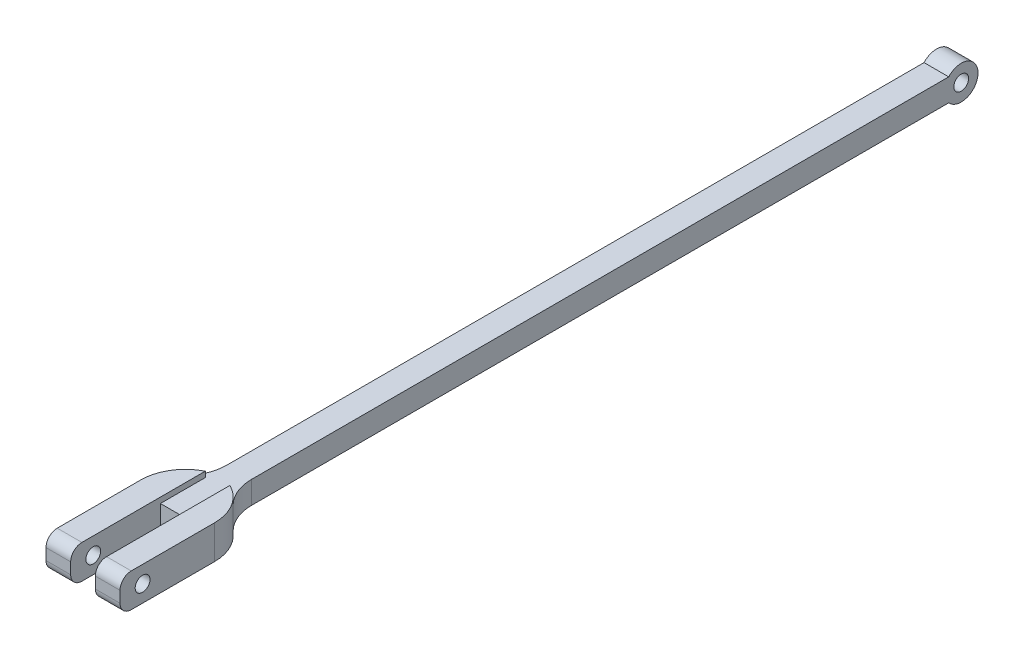
ISO-10303-21;
HEADER;
FILE_DESCRIPTION(('STEP AP214'),'2;1');
FILE_NAME('part.step','',(''),(''),'','','');
FILE_SCHEMA(('AUTOMOTIVE_DESIGN { 1 0 10303 214 1 1 1 1 }'));
ENDSEC;
DATA;
#1=APPLICATION_CONTEXT('core data for automotive mechanical design processes');
#2=APPLICATION_PROTOCOL_DEFINITION('international standard','automotive_design',2000,#1);
#3=PRODUCT_CONTEXT('',#1,'mechanical');
#4=PRODUCT('Part','Part','',(#3));
#5=PRODUCT_RELATED_PRODUCT_CATEGORY('part','',(#4));
#6=PRODUCT_DEFINITION_FORMATION('','',#4);
#7=PRODUCT_DEFINITION_CONTEXT('part definition',#1,'design');
#8=PRODUCT_DEFINITION('design','',#6,#7);
#9=PRODUCT_DEFINITION_SHAPE('','',#8);
#10=(LENGTH_UNIT() NAMED_UNIT(*) SI_UNIT(.MILLI.,.METRE.));
#11=(NAMED_UNIT(*) PLANE_ANGLE_UNIT() SI_UNIT($,.RADIAN.));
#12=(NAMED_UNIT(*) SI_UNIT($,.STERADIAN.) SOLID_ANGLE_UNIT());
#13=UNCERTAINTY_MEASURE_WITH_UNIT(LENGTH_MEASURE(1.E-05),#10,'distance_accuracy_value','');
#14=(GEOMETRIC_REPRESENTATION_CONTEXT(3) GLOBAL_UNCERTAINTY_ASSIGNED_CONTEXT((#13)) GLOBAL_UNIT_ASSIGNED_CONTEXT((#10,
#11,#12)) REPRESENTATION_CONTEXT('',''));
#15=CARTESIAN_POINT('',(0.,0.,0.));
#16=DIRECTION('',(0.,0.,1.));
#17=DIRECTION('',(1.,0.,0.));
#18=AXIS2_PLACEMENT_3D('',#15,#16,#17);
#19=CARTESIAN_POINT('',(-6.985,-6.3793641618497,-198.12));
#20=DIRECTION('',(-1.,0.,0.));
#21=DIRECTION('',(0.,0.,1.));
#22=AXIS2_PLACEMENT_3D('',#19,#20,#21);
#23=PLANE('',#22);
#24=CARTESIAN_POINT('',(-6.985,0.,-198.12));
#25=DIRECTION('',(1.,0.,0.));
#26=DIRECTION('',(0.,0.,-1.));
#27=AXIS2_PLACEMENT_3D('',#24,#25,#26);
#28=CIRCLE('',#27,4.191);
#29=CARTESIAN_POINT('',(-6.985,0.,-202.311));
#30=VERTEX_POINT('',#29);
#31=EDGE_CURVE('E259',#30,#30,#28,.T.);
#32=ORIENTED_EDGE('',*,*,#31,.T.);
#33=EDGE_LOOP('',(#32));
#34=FACE_BOUND('',#33,.T.);
#35=DIRECTION('',(0.,0.,1.));
#36=VECTOR('',#35,1.);
#37=CARTESIAN_POINT('',(-6.985,-6.3793641618497,-198.12));
#38=LINE('',#37,#36);
#39=CARTESIAN_POINT('',(-6.985,-6.3793641618497,-191.046857990221));
#40=VERTEX_POINT('',#39);
#41=CARTESIAN_POINT('',(-6.985,-6.3793641618497,203.571866357789));
#42=VERTEX_POINT('',#41);
#43=EDGE_CURVE('E298',#40,#42,#38,.T.);
#44=ORIENTED_EDGE('',*,*,#43,.T.);
#45=DIRECTION('',(0.,-1.,0.));
#46=VECTOR('',#45,1.);
#47=CARTESIAN_POINT('',(-6.985,6.3793641618497,203.571866357789));
#48=LINE('',#47,#46);
#49=CARTESIAN_POINT('',(-6.985,6.3793641618497,203.571866357789));
#50=VERTEX_POINT('',#49);
#51=EDGE_CURVE('E309',#42,#50,#48,.F.);
#52=ORIENTED_EDGE('',*,*,#51,.T.);
#53=DIRECTION('',(0.,0.,1.));
#54=VECTOR('',#53,1.);
#55=CARTESIAN_POINT('',(-6.985,6.3793641618497,-198.12));
#56=LINE('',#55,#54);
#57=CARTESIAN_POINT('',(-6.985,6.3793641618497,-191.046857990221));
#58=VERTEX_POINT('',#57);
#59=EDGE_CURVE('E284',#58,#50,#56,.T.);
#60=ORIENTED_EDGE('',*,*,#59,.F.);
#61=CARTESIAN_POINT('',(-6.985,0.,-198.12));
#62=DIRECTION('',(-1.,0.,0.));
#63=DIRECTION('',(0.,0.,1.));
#64=AXIS2_PLACEMENT_3D('',#61,#62,#63);
#65=CIRCLE('',#64,9.525);
#66=EDGE_CURVE('E262',#40,#58,#65,.F.);
#67=ORIENTED_EDGE('',*,*,#66,.F.);
#68=EDGE_LOOP('',(#44,#52,#60,#67));
#69=FACE_BOUND('',#68,.T.);
#70=ADVANCED_FACE('F42',(#34,#69),#23,.T.);
#71=CARTESIAN_POINT('',(6.985,6.3793641618497,-198.12));
#72=DIRECTION('',(0.,1.,0.));
#73=DIRECTION('',(0.,0.,1.));
#74=AXIS2_PLACEMENT_3D('',#71,#72,#73);
#75=PLANE('',#74);
#76=DIRECTION('',(0.,0.,1.));
#77=VECTOR('',#76,1.);
#78=CARTESIAN_POINT('',(6.985,6.3793641618497,-198.12));
#79=LINE('',#78,#77);
#80=CARTESIAN_POINT('',(6.985,6.37936416184971,-191.046857990221));
#81=VERTEX_POINT('',#80);
#82=CARTESIAN_POINT('',(6.985,6.3793641618497,203.571866357789));
#83=VERTEX_POINT('',#82);
#84=EDGE_CURVE('E286',#81,#83,#79,.T.);
#85=ORIENTED_EDGE('',*,*,#84,.F.);
#86=DIRECTION('',(-1.,0.,0.));
#87=VECTOR('',#86,1.);
#88=CARTESIAN_POINT('',(33.9257683632075,6.3793641618497,-191.046857990221));
#89=LINE('',#88,#87);
#90=EDGE_CURVE('E266',#81,#58,#89,.T.);
#91=ORIENTED_EDGE('',*,*,#90,.T.);
#92=ORIENTED_EDGE('',*,*,#59,.T.);
#93=CARTESIAN_POINT('',(-32.385,6.3793641618497,203.571866357789));
#94=DIRECTION('',(0.,1.,0.));
#95=DIRECTION('',(0.,0.,1.));
#96=AXIS2_PLACEMENT_3D('',#93,#94,#95);
#97=CIRCLE('',#96,25.4);
#98=CARTESIAN_POINT('',(-13.9843441680406,6.3793641618497,221.08117430967));
#99=VERTEX_POINT('',#98);
#100=EDGE_CURVE('E323',#50,#99,#97,.F.);
#101=ORIENTED_EDGE('',*,*,#100,.T.);
#102=CARTESIAN_POINT('',(4.34089256950787,6.3793641618497,238.518716550504));
#103=DIRECTION('',(0.,1.,0.));
#104=DIRECTION('',(0.,0.,1.));
#105=AXIS2_PLACEMENT_3D('',#102,#103,#104);
#106=CIRCLE('',#105,25.2958925695079);
#107=CARTESIAN_POINT('',(-6.985,6.3793641618497,215.9));
#108=VERTEX_POINT('',#107);
#109=EDGE_CURVE('E319',#108,#99,#106,.T.);
#110=ORIENTED_EDGE('',*,*,#109,.F.);
#111=CARTESIAN_POINT('',(-6.985,6.3793641618497,241.3));
#112=VERTEX_POINT('',#111);
#113=EDGE_CURVE('E290',#108,#112,#56,.T.);
#114=ORIENTED_EDGE('',*,*,#113,.T.);
#115=DIRECTION('',(-1.,0.,0.));
#116=VECTOR('',#115,1.);
#117=CARTESIAN_POINT('',(6.985,6.3793641618497,241.3));
#118=LINE('',#117,#116);
#119=CARTESIAN_POINT('',(6.985,6.3793641618497,241.3));
#120=VERTEX_POINT('',#119);
#121=EDGE_CURVE('E276',#120,#112,#118,.T.);
#122=ORIENTED_EDGE('',*,*,#121,.F.);
#123=CARTESIAN_POINT('',(6.98500000000001,6.37936416184969,215.9));
#124=VERTEX_POINT('',#123);
#125=EDGE_CURVE('E293',#124,#120,#79,.T.);
#126=ORIENTED_EDGE('',*,*,#125,.F.);
#127=CARTESIAN_POINT('',(-4.34089256950787,6.3793641618497,238.518716550504));
#128=DIRECTION('',(0.,1.,0.));
#129=DIRECTION('',(0.,0.,1.));
#130=AXIS2_PLACEMENT_3D('',#127,#128,#129);
#131=CIRCLE('',#130,25.2958925695079);
#132=CARTESIAN_POINT('',(13.9843441680406,6.3793641618497,221.08117430967));
#133=VERTEX_POINT('',#132);
#134=EDGE_CURVE('E306',#133,#124,#131,.T.);
#135=ORIENTED_EDGE('',*,*,#134,.F.);
#136=CARTESIAN_POINT('',(32.385,6.3793641618497,203.571866357789));
#137=DIRECTION('',(0.,1.,0.));
#138=DIRECTION('',(0.,0.,1.));
#139=AXIS2_PLACEMENT_3D('',#136,#137,#138);
#140=CIRCLE('',#139,25.4);
#141=EDGE_CURVE('E322',#133,#83,#140,.F.);
#142=ORIENTED_EDGE('',*,*,#141,.T.);
#143=EDGE_LOOP('',(#85,#91,#92,#101,#110,#114,#122,#126,#135,#142));
#144=FACE_BOUND('',#143,.T.);
#145=ADVANCED_FACE('F401',(#144),#75,.T.);
#146=CARTESIAN_POINT('',(6.985,-6.3793641618497,-198.12));
#147=DIRECTION('',(0.,-1.,0.));
#148=DIRECTION('',(0.,0.,-1.));
#149=AXIS2_PLACEMENT_3D('',#146,#147,#148);
#150=PLANE('',#149);
#151=ORIENTED_EDGE('',*,*,#43,.F.);
#152=DIRECTION('',(-1.,0.,0.));
#153=VECTOR('',#152,1.);
#154=CARTESIAN_POINT('',(33.9257683632075,-6.3793641618497,-191.046857990221));
#155=LINE('',#154,#153);
#156=CARTESIAN_POINT('',(6.985,-6.3793641618497,-191.046857990221));
#157=VERTEX_POINT('',#156);
#158=EDGE_CURVE('E288',#40,#157,#155,.F.);
#159=ORIENTED_EDGE('',*,*,#158,.T.);
#160=DIRECTION('',(0.,0.,1.));
#161=VECTOR('',#160,1.);
#162=CARTESIAN_POINT('',(6.985,-6.3793641618497,-198.12));
#163=LINE('',#162,#161);
#164=CARTESIAN_POINT('',(6.985,-6.3793641618497,203.571866357789));
#165=VERTEX_POINT('',#164);
#166=EDGE_CURVE('E292',#157,#165,#163,.T.);
#167=ORIENTED_EDGE('',*,*,#166,.T.);
#168=CARTESIAN_POINT('',(32.385,-6.3793641618497,203.571866357789));
#169=DIRECTION('',(0.,-1.,0.));
#170=DIRECTION('',(0.,0.,-1.));
#171=AXIS2_PLACEMENT_3D('',#168,#169,#170);
#172=CIRCLE('',#171,25.4);
#173=CARTESIAN_POINT('',(13.9843441680406,-6.3793641618497,221.08117430967));
#174=VERTEX_POINT('',#173);
#175=EDGE_CURVE('E324',#165,#174,#172,.F.);
#176=ORIENTED_EDGE('',*,*,#175,.T.);
#177=CARTESIAN_POINT('',(-4.34089256950787,-6.3793641618497,238.518716550504));
#178=DIRECTION('',(0.,-1.,0.));
#179=DIRECTION('',(0.,0.,-1.));
#180=AXIS2_PLACEMENT_3D('',#177,#178,#179);
#181=CIRCLE('',#180,25.2958925695079);
#182=CARTESIAN_POINT('',(6.985,-6.3793641618497,215.9));
#183=VERTEX_POINT('',#182);
#184=EDGE_CURVE('E301',#183,#174,#181,.T.);
#185=ORIENTED_EDGE('',*,*,#184,.F.);
#186=CARTESIAN_POINT('',(6.985,-6.3793641618497,241.3));
#187=VERTEX_POINT('',#186);
#188=EDGE_CURVE('E294',#183,#187,#163,.T.);
#189=ORIENTED_EDGE('',*,*,#188,.T.);
#190=DIRECTION('',(1.,0.,0.));
#191=VECTOR('',#190,1.);
#192=CARTESIAN_POINT('',(6.985,-6.3793641618497,241.3));
#193=LINE('',#192,#191);
#194=CARTESIAN_POINT('',(-6.985,-6.3793641618497,241.3));
#195=VERTEX_POINT('',#194);
#196=EDGE_CURVE('E274',#195,#187,#193,.T.);
#197=ORIENTED_EDGE('',*,*,#196,.F.);
#198=CARTESIAN_POINT('',(-6.98500000000001,-6.3793641618497,215.9));
#199=VERTEX_POINT('',#198);
#200=EDGE_CURVE('E285',#199,#195,#38,.T.);
#201=ORIENTED_EDGE('',*,*,#200,.F.);
#202=CARTESIAN_POINT('',(4.34089256950787,-6.3793641618497,238.518716550504));
#203=DIRECTION('',(0.,-1.,0.));
#204=DIRECTION('',(0.,0.,-1.));
#205=AXIS2_PLACEMENT_3D('',#202,#203,#204);
#206=CIRCLE('',#205,25.2958925695079);
#207=CARTESIAN_POINT('',(-13.9843441680406,-6.3793641618497,221.08117430967));
#208=VERTEX_POINT('',#207);
#209=EDGE_CURVE('E312',#208,#199,#206,.T.);
#210=ORIENTED_EDGE('',*,*,#209,.F.);
#211=CARTESIAN_POINT('',(-32.385,-6.3793641618497,203.571866357789));
#212=DIRECTION('',(0.,-1.,0.));
#213=DIRECTION('',(0.,0.,-1.));
#214=AXIS2_PLACEMENT_3D('',#211,#212,#213);
#215=CIRCLE('',#214,25.4);
#216=EDGE_CURVE('E330',#208,#42,#215,.F.);
#217=ORIENTED_EDGE('',*,*,#216,.T.);
#218=EDGE_LOOP('',(#151,#159,#167,#176,#185,#189,#197,#201,#210,#217));
#219=FACE_BOUND('',#218,.T.);
#220=ADVANCED_FACE('F408',(#219),#150,.T.);
#221=CARTESIAN_POINT('',(6.985,-6.3793641618497,-198.12));
#222=DIRECTION('',(1.,0.,0.));
#223=DIRECTION('',(0.,0.,-1.));
#224=AXIS2_PLACEMENT_3D('',#221,#222,#223);
#225=PLANE('',#224);
#226=ORIENTED_EDGE('',*,*,#84,.T.);
#227=DIRECTION('',(0.,1.,0.));
#228=VECTOR('',#227,1.);
#229=CARTESIAN_POINT('',(6.985,-6.3793641618497,203.571866357789));
#230=LINE('',#229,#228);
#231=EDGE_CURVE('E308',#83,#165,#230,.F.);
#232=ORIENTED_EDGE('',*,*,#231,.T.);
#233=ORIENTED_EDGE('',*,*,#166,.F.);
#234=CARTESIAN_POINT('',(6.985,0.,-198.12));
#235=DIRECTION('',(1.,0.,0.));
#236=DIRECTION('',(0.,0.,-1.));
#237=AXIS2_PLACEMENT_3D('',#234,#235,#236);
#238=CIRCLE('',#237,9.525);
#239=EDGE_CURVE('E263',#157,#81,#238,.T.);
#240=ORIENTED_EDGE('',*,*,#239,.T.);
#241=EDGE_LOOP('',(#226,#232,#233,#240));
#242=FACE_BOUND('',#241,.T.);
#243=CARTESIAN_POINT('',(6.985,0.,-198.12));
#244=DIRECTION('',(1.,0.,0.));
#245=DIRECTION('',(0.,0.,-1.));
#246=AXIS2_PLACEMENT_3D('',#243,#244,#245);
#247=CIRCLE('',#246,4.191);
#248=CARTESIAN_POINT('',(6.985,0.,-202.311));
#249=VERTEX_POINT('',#248);
#250=EDGE_CURVE('E248',#249,#249,#247,.T.);
#251=ORIENTED_EDGE('',*,*,#250,.F.);
#252=EDGE_LOOP('',(#251));
#253=FACE_BOUND('',#252,.T.);
#254=ADVANCED_FACE('F488',(#242,#253),#225,.T.);
#255=CARTESIAN_POINT('',(0.,0.,241.3));
#256=DIRECTION('',(0.,0.,1.));
#257=DIRECTION('',(1.,0.,0.));
#258=AXIS2_PLACEMENT_3D('',#255,#256,#257);
#259=PLANE('',#258);
#260=DIRECTION('',(0.,-1.,0.));
#261=VECTOR('',#260,1.);
#262=CARTESIAN_POINT('',(-6.985,-6.3793641618497,241.3));
#263=LINE('',#262,#261);
#264=EDGE_CURVE('E272',#112,#195,#263,.T.);
#265=ORIENTED_EDGE('',*,*,#264,.T.);
#266=ORIENTED_EDGE('',*,*,#196,.T.);
#267=DIRECTION('',(0.,1.,0.));
#268=VECTOR('',#267,1.);
#269=CARTESIAN_POINT('',(6.985,-6.3793641618497,241.3));
#270=LINE('',#269,#268);
#271=EDGE_CURVE('E280',#187,#120,#270,.T.);
#272=ORIENTED_EDGE('',*,*,#271,.T.);
#273=ORIENTED_EDGE('',*,*,#121,.T.);
#274=EDGE_LOOP('',(#265,#266,#272,#273));
#275=FACE_BOUND('',#274,.T.);
#276=ADVANCED_FACE('F477',(#275),#259,.T.);
#277=CARTESIAN_POINT('',(33.9257683632075,0.,-198.12));
#278=DIRECTION('',(-1.,0.,0.));
#279=DIRECTION('',(0.,0.,1.));
#280=AXIS2_PLACEMENT_3D('',#277,#278,#279);
#281=CYLINDRICAL_SURFACE('',#280,9.525);
#282=ORIENTED_EDGE('',*,*,#90,.F.);
#283=ORIENTED_EDGE('',*,*,#239,.F.);
#284=ORIENTED_EDGE('',*,*,#158,.F.);
#285=ORIENTED_EDGE('',*,*,#66,.T.);
#286=EDGE_LOOP('',(#282,#283,#284,#285));
#287=FACE_BOUND('',#286,.T.);
#288=ADVANCED_FACE('F495',(#287),#281,.T.);
#289=CARTESIAN_POINT('',(-6.985,0.,-198.12));
#290=DIRECTION('',(1.,0.,0.));
#291=DIRECTION('',(0.,0.,-1.));
#292=AXIS2_PLACEMENT_3D('',#289,#290,#291);
#293=CYLINDRICAL_SURFACE('',#292,4.191);
#294=CARTESIAN_POINT('',(-6.985,0.,-202.311));
#295=CARTESIAN_POINT('',(-6.83947916666667,0.,-202.311));
#296=CARTESIAN_POINT('',(-6.69395833333334,0.,-202.311));
#297=CARTESIAN_POINT('',(-6.40291666666667,0.,-202.311));
#298=CARTESIAN_POINT('',(-6.25739583333334,0.,-202.311));
#299=CARTESIAN_POINT('',(-5.96635416666667,0.,-202.311));
#300=CARTESIAN_POINT('',(-5.82083333333334,0.,-202.311));
#301=CARTESIAN_POINT('',(-5.52979166666667,0.,-202.311));
#302=CARTESIAN_POINT('',(-5.38427083333334,0.,-202.311));
#303=CARTESIAN_POINT('',(-5.09322916666667,0.,-202.311));
#304=CARTESIAN_POINT('',(-4.94770833333334,0.,-202.311));
#305=CARTESIAN_POINT('',(-4.65666666666667,0.,-202.311));
#306=CARTESIAN_POINT('',(-4.51114583333334,0.,-202.311));
#307=CARTESIAN_POINT('',(-4.22010416666667,0.,-202.311));
#308=CARTESIAN_POINT('',(-4.07458333333334,0.,-202.311));
#309=CARTESIAN_POINT('',(-3.78354166666667,0.,-202.311));
#310=CARTESIAN_POINT('',(-3.63802083333334,0.,-202.311));
#311=CARTESIAN_POINT('',(-3.34697916666667,0.,-202.311));
#312=CARTESIAN_POINT('',(-3.20145833333334,0.,-202.311));
#313=CARTESIAN_POINT('',(-2.91041666666667,0.,-202.311));
#314=CARTESIAN_POINT('',(-2.76489583333334,0.,-202.311));
#315=CARTESIAN_POINT('',(-2.47385416666667,0.,-202.311));
#316=CARTESIAN_POINT('',(-2.32833333333334,0.,-202.311));
#317=CARTESIAN_POINT('',(-2.03729166666667,0.,-202.311));
#318=CARTESIAN_POINT('',(-1.89177083333334,0.,-202.311));
#319=CARTESIAN_POINT('',(-1.60072916666667,0.,-202.311));
#320=CARTESIAN_POINT('',(-1.45520833333334,0.,-202.311));
#321=CARTESIAN_POINT('',(-1.16416666666667,0.,-202.311));
#322=CARTESIAN_POINT('',(-1.01864583333334,0.,-202.311));
#323=CARTESIAN_POINT('',(-0.727604166666669,0.,-202.311));
#324=CARTESIAN_POINT('',(-0.582083333333336,0.,-202.311));
#325=CARTESIAN_POINT('',(-0.291041666666669,0.,-202.311));
#326=CARTESIAN_POINT('',(-0.145520833333335,0.,-202.311));
#327=CARTESIAN_POINT('',(0.145520833333332,0.,-202.311));
#328=CARTESIAN_POINT('',(0.291041666666665,0.,-202.311));
#329=CARTESIAN_POINT('',(0.582083333333332,0.,-202.311));
#330=CARTESIAN_POINT('',(0.727604166666665,0.,-202.311));
#331=CARTESIAN_POINT('',(1.01864583333333,0.,-202.311));
#332=CARTESIAN_POINT('',(1.16416666666666,0.,-202.311));
#333=CARTESIAN_POINT('',(1.45520833333333,0.,-202.311));
#334=CARTESIAN_POINT('',(1.60072916666666,0.,-202.311));
#335=CARTESIAN_POINT('',(1.89177083333333,0.,-202.311));
#336=CARTESIAN_POINT('',(2.03729166666667,0.,-202.311));
#337=CARTESIAN_POINT('',(2.32833333333333,0.,-202.311));
#338=CARTESIAN_POINT('',(2.47385416666666,0.,-202.311));
#339=CARTESIAN_POINT('',(2.76489583333333,0.,-202.311));
#340=CARTESIAN_POINT('',(2.91041666666667,0.,-202.311));
#341=CARTESIAN_POINT('',(3.20145833333333,0.,-202.311));
#342=CARTESIAN_POINT('',(3.34697916666667,0.,-202.311));
#343=CARTESIAN_POINT('',(3.63802083333333,0.,-202.311));
#344=CARTESIAN_POINT('',(3.78354166666666,0.,-202.311));
#345=CARTESIAN_POINT('',(4.07458333333333,0.,-202.311));
#346=CARTESIAN_POINT('',(4.22010416666667,0.,-202.311));
#347=CARTESIAN_POINT('',(4.51114583333333,0.,-202.311));
#348=CARTESIAN_POINT('',(4.65666666666666,0.,-202.311));
#349=CARTESIAN_POINT('',(4.94770833333333,0.,-202.311));
#350=CARTESIAN_POINT('',(5.09322916666666,0.,-202.311));
#351=CARTESIAN_POINT('',(5.38427083333333,0.,-202.311));
#352=CARTESIAN_POINT('',(5.52979166666667,0.,-202.311));
#353=CARTESIAN_POINT('',(5.82083333333333,0.,-202.311));
#354=CARTESIAN_POINT('',(5.96635416666667,0.,-202.311));
#355=CARTESIAN_POINT('',(6.25739583333333,0.,-202.311));
#356=CARTESIAN_POINT('',(6.40291666666667,0.,-202.311));
#357=CARTESIAN_POINT('',(6.69395833333333,0.,-202.311));
#358=CARTESIAN_POINT('',(6.83947916666667,0.,-202.311));
#359=CARTESIAN_POINT('',(6.985,0.,-202.311));
#360=B_SPLINE_CURVE_WITH_KNOTS('',3,(#294,#295,#296,#297,#298,#299,#300,#301,#302,#303,#304,
#305,#306,#307,#308,#309,#310,#311,#312,#313,#314,#315,#316,#317,#318,#319,#320,#321,#322,#323,
#324,#325,#326,#327,#328,#329,#330,#331,#332,#333,#334,#335,#336,#337,#338,#339,#340,#341,#342,
#343,#344,#345,#346,#347,#348,#349,#350,#351,#352,#353,#354,#355,#356,#357,#358,#359),
.UNSPECIFIED.,.F.,.F.,(4,2,2,2,2,2,2,2,2,2,2,2,2,2,2,2,2,2,2,2,2,2,2,2,2,2,2,2,2,2,2,2,4),(0.,
0.436562499999999,0.873125,1.3096875,1.74625,2.1828125,2.619375,3.0559375,3.4925,3.9290625,
4.365625,4.8021875,5.23875,5.6753125,6.111875,6.5484375,6.985,7.4215625,7.858125,8.2946875,
8.73125,9.1678125,9.604375,10.0409375,10.4775,10.9140625,11.350625,11.7871875,12.22375,
12.6603125,13.096875,13.5334375,13.97),.UNSPECIFIED.);
#361=EDGE_CURVE('BSEAM497',#30,#249,#360,.T.);
#362=ORIENTED_EDGE('',*,*,#31,.F.);
#363=ORIENTED_EDGE('',*,*,#250,.T.);
#364=ORIENTED_EDGE('',*,*,#361,.T.);
#365=ORIENTED_EDGE('',*,*,#361,.F.);
#366=EDGE_LOOP('',(#362,#364,#363,#365));
#367=FACE_BOUND('',#366,.T.);
#368=ADVANCED_FACE('F497',(#367),#293,.F.);
#369=CARTESIAN_POINT('',(-6.985,-9.525,241.3));
#370=DIRECTION('',(1.,0.,0.));
#371=DIRECTION('',(0.,0.,-1.));
#372=AXIS2_PLACEMENT_3D('',#369,#370,#371);
#373=PLANE('',#372);
#374=CARTESIAN_POINT('',(-6.985,0.,279.324500259563));
#375=DIRECTION('',(1.,0.,0.));
#376=DIRECTION('',(0.,0.,-1.));
#377=AXIS2_PLACEMENT_3D('',#374,#375,#376);
#378=CIRCLE('',#377,4.19099999999997);
#379=CARTESIAN_POINT('',(-6.985,0.,275.133500259563));
#380=VERTEX_POINT('',#379);
#381=EDGE_CURVE('E374',#380,#380,#378,.T.);
#382=ORIENTED_EDGE('',*,*,#381,.F.);
#383=EDGE_LOOP('',(#382));
#384=FACE_BOUND('',#383,.T.);
#385=DIRECTION('',(0.,1.,0.));
#386=VECTOR('',#385,1.);
#387=CARTESIAN_POINT('',(-6.985,-9.525,292.1));
#388=LINE('',#387,#386);
#389=CARTESIAN_POINT('',(-6.985,-3.175,292.1));
#390=VERTEX_POINT('',#389);
#391=CARTESIAN_POINT('',(-6.985,3.175,292.1));
#392=VERTEX_POINT('',#391);
#393=EDGE_CURVE('E246',#390,#392,#388,.T.);
#394=ORIENTED_EDGE('',*,*,#393,.F.);
#395=CARTESIAN_POINT('',(-6.985,-3.175,285.75));
#396=DIRECTION('',(1.,0.,0.));
#397=DIRECTION('',(0.,0.,-1.));
#398=AXIS2_PLACEMENT_3D('',#395,#396,#397);
#399=CIRCLE('',#398,6.35);
#400=CARTESIAN_POINT('',(-6.985,-9.525,285.75));
#401=VERTEX_POINT('',#400);
#402=EDGE_CURVE('E337',#390,#401,#399,.T.);
#403=ORIENTED_EDGE('',*,*,#402,.T.);
#404=DIRECTION('',(0.,0.,-1.));
#405=VECTOR('',#404,1.);
#406=CARTESIAN_POINT('',(-6.985,-9.525,215.9));
#407=LINE('',#406,#405);
#408=CARTESIAN_POINT('',(-6.98500000000001,-9.525,215.9));
#409=VERTEX_POINT('',#408);
#410=EDGE_CURVE('E240',#401,#409,#407,.T.);
#411=ORIENTED_EDGE('',*,*,#410,.T.);
#412=DIRECTION('',(0.,1.,0.));
#413=VECTOR('',#412,1.);
#414=CARTESIAN_POINT('',(-6.98500000000001,-9.525,215.9));
#415=LINE('',#414,#413);
#416=EDGE_CURVE('E253',#409,#199,#415,.T.);
#417=ORIENTED_EDGE('',*,*,#416,.T.);
#418=ORIENTED_EDGE('',*,*,#200,.T.);
#419=ORIENTED_EDGE('',*,*,#264,.F.);
#420=ORIENTED_EDGE('',*,*,#113,.F.);
#421=CARTESIAN_POINT('',(-6.98500000000001,9.525,215.9));
#422=VERTEX_POINT('',#421);
#423=EDGE_CURVE('E244',#108,#422,#415,.T.);
#424=ORIENTED_EDGE('',*,*,#423,.T.);
#425=DIRECTION('',(0.,0.,-1.));
#426=VECTOR('',#425,1.);
#427=CARTESIAN_POINT('',(-6.985,9.525,215.9));
#428=LINE('',#427,#426);
#429=CARTESIAN_POINT('',(-6.985,9.525,285.75));
#430=VERTEX_POINT('',#429);
#431=EDGE_CURVE('E222',#430,#422,#428,.T.);
#432=ORIENTED_EDGE('',*,*,#431,.F.);
#433=CARTESIAN_POINT('',(-6.985,3.175,285.75));
#434=DIRECTION('',(1.,0.,0.));
#435=DIRECTION('',(0.,0.,-1.));
#436=AXIS2_PLACEMENT_3D('',#433,#434,#435);
#437=CIRCLE('',#436,6.35);
#438=EDGE_CURVE('E334',#430,#392,#437,.T.);
#439=ORIENTED_EDGE('',*,*,#438,.T.);
#440=EDGE_LOOP('',(#394,#403,#411,#417,#418,#419,#420,#424,#432,#439));
#441=FACE_BOUND('',#440,.T.);
#442=ADVANCED_FACE('F469',(#384,#441),#373,.T.);
#443=CARTESIAN_POINT('',(-6.985,-9.525,292.1));
#444=DIRECTION('',(0.,0.,1.));
#445=DIRECTION('',(1.,0.,0.));
#446=AXIS2_PLACEMENT_3D('',#443,#444,#445);
#447=PLANE('',#446);
#448=DIRECTION('',(0.,1.,0.));
#449=VECTOR('',#448,1.);
#450=CARTESIAN_POINT('',(-20.955,-9.525,292.1));
#451=LINE('',#450,#449);
#452=CARTESIAN_POINT('',(-20.955,-3.175,292.1));
#453=VERTEX_POINT('',#452);
#454=CARTESIAN_POINT('',(-20.955,3.175,292.1));
#455=VERTEX_POINT('',#454);
#456=EDGE_CURVE('E249',#453,#455,#451,.T.);
#457=ORIENTED_EDGE('',*,*,#456,.F.);
#458=DIRECTION('',(1.,0.,0.));
#459=VECTOR('',#458,1.);
#460=CARTESIAN_POINT('',(-6.985,-3.175,292.1));
#461=LINE('',#460,#459);
#462=EDGE_CURVE('E333',#453,#390,#461,.T.);
#463=ORIENTED_EDGE('',*,*,#462,.T.);
#464=ORIENTED_EDGE('',*,*,#393,.T.);
#465=DIRECTION('',(1.,0.,0.));
#466=VECTOR('',#465,1.);
#467=CARTESIAN_POINT('',(-20.955,3.175,292.1));
#468=LINE('',#467,#466);
#469=EDGE_CURVE('E326',#392,#455,#468,.F.);
#470=ORIENTED_EDGE('',*,*,#469,.T.);
#471=EDGE_LOOP('',(#457,#463,#464,#470));
#472=FACE_BOUND('',#471,.T.);
#473=ADVANCED_FACE('F467',(#472),#447,.T.);
#474=CARTESIAN_POINT('',(-20.955,-9.525,292.1));
#475=DIRECTION('',(-1.,0.,0.));
#476=DIRECTION('',(0.,0.,1.));
#477=AXIS2_PLACEMENT_3D('',#474,#475,#476);
#478=PLANE('',#477);
#479=CARTESIAN_POINT('',(-20.955,0.,279.324500259563));
#480=DIRECTION('',(1.,0.,0.));
#481=DIRECTION('',(0.,0.,-1.));
#482=AXIS2_PLACEMENT_3D('',#479,#480,#481);
#483=CIRCLE('',#482,4.19099999999997);
#484=CARTESIAN_POINT('',(-20.955,0.,275.133500259563));
#485=VERTEX_POINT('',#484);
#486=EDGE_CURVE('E385',#485,#485,#483,.T.);
#487=ORIENTED_EDGE('',*,*,#486,.T.);
#488=EDGE_LOOP('',(#487));
#489=FACE_BOUND('',#488,.T.);
#490=DIRECTION('',(0.,0.,1.));
#491=VECTOR('',#490,1.);
#492=CARTESIAN_POINT('',(-20.955,-9.525,292.1));
#493=LINE('',#492,#491);
#494=CARTESIAN_POINT('',(-20.955,-9.525,238.518716550504));
#495=VERTEX_POINT('',#494);
#496=CARTESIAN_POINT('',(-20.955,-9.525,285.75));
#497=VERTEX_POINT('',#496);
#498=EDGE_CURVE('E245',#495,#497,#493,.T.);
#499=ORIENTED_EDGE('',*,*,#498,.T.);
#500=CARTESIAN_POINT('',(-20.955,-3.175,285.75));
#501=DIRECTION('',(-1.,0.,0.));
#502=DIRECTION('',(0.,0.,1.));
#503=AXIS2_PLACEMENT_3D('',#500,#501,#502);
#504=CIRCLE('',#503,6.35);
#505=EDGE_CURVE('E345',#497,#453,#504,.T.);
#506=ORIENTED_EDGE('',*,*,#505,.T.);
#507=ORIENTED_EDGE('',*,*,#456,.T.);
#508=CARTESIAN_POINT('',(-20.955,3.175,285.75));
#509=DIRECTION('',(-1.,0.,0.));
#510=DIRECTION('',(0.,0.,1.));
#511=AXIS2_PLACEMENT_3D('',#508,#509,#510);
#512=CIRCLE('',#511,6.35);
#513=CARTESIAN_POINT('',(-20.955,9.525,285.75));
#514=VERTEX_POINT('',#513);
#515=EDGE_CURVE('E338',#455,#514,#512,.T.);
#516=ORIENTED_EDGE('',*,*,#515,.T.);
#517=DIRECTION('',(0.,0.,1.));
#518=VECTOR('',#517,1.);
#519=CARTESIAN_POINT('',(-20.955,9.525,292.1));
#520=LINE('',#519,#518);
#521=CARTESIAN_POINT('',(-20.955,9.525,238.518716550504));
#522=VERTEX_POINT('',#521);
#523=EDGE_CURVE('E234',#522,#514,#520,.T.);
#524=ORIENTED_EDGE('',*,*,#523,.F.);
#525=DIRECTION('',(0.,1.,0.));
#526=VECTOR('',#525,1.);
#527=CARTESIAN_POINT('',(-20.955,-9.525,238.518716550504));
#528=LINE('',#527,#526);
#529=EDGE_CURVE('E254',#495,#522,#528,.T.);
#530=ORIENTED_EDGE('',*,*,#529,.F.);
#531=EDGE_LOOP('',(#499,#506,#507,#516,#524,#530));
#532=FACE_BOUND('',#531,.T.);
#533=ADVANCED_FACE('F444',(#489,#532),#478,.T.);
#534=CARTESIAN_POINT('',(4.34089256950787,-9.525,238.518716550504));
#535=DIRECTION('',(0.,1.,0.));
#536=DIRECTION('',(0.,0.,1.));
#537=AXIS2_PLACEMENT_3D('',#534,#535,#536);
#538=CYLINDRICAL_SURFACE('',#537,25.2958925695079);
#539=ORIENTED_EDGE('',*,*,#423,.F.);
#540=ORIENTED_EDGE('',*,*,#109,.T.);
#541=DIRECTION('',(0.,1.,0.));
#542=VECTOR('',#541,1.);
#543=CARTESIAN_POINT('',(-13.9843441680406,-9.525,221.08117430967));
#544=LINE('',#543,#542);
#545=EDGE_CURVE('E314',#99,#208,#544,.F.);
#546=ORIENTED_EDGE('',*,*,#545,.T.);
#547=ORIENTED_EDGE('',*,*,#209,.T.);
#548=ORIENTED_EDGE('',*,*,#416,.F.);
#549=CARTESIAN_POINT('',(4.34089256950787,-9.525,238.518716550504));
#550=DIRECTION('',(0.,1.,0.));
#551=DIRECTION('',(0.,0.,-1.));
#552=AXIS2_PLACEMENT_3D('',#549,#550,#551);
#553=CIRCLE('',#552,25.2958925695079);
#554=EDGE_CURVE('E237',#409,#495,#553,.T.);
#555=ORIENTED_EDGE('',*,*,#554,.T.);
#556=ORIENTED_EDGE('',*,*,#529,.T.);
#557=CARTESIAN_POINT('',(4.34089256950787,9.525,238.518716550504));
#558=DIRECTION('',(0.,1.,0.));
#559=DIRECTION('',(0.,0.,-1.));
#560=AXIS2_PLACEMENT_3D('',#557,#558,#559);
#561=CIRCLE('',#560,25.2958925695079);
#562=EDGE_CURVE('E233',#422,#522,#561,.T.);
#563=ORIENTED_EDGE('',*,*,#562,.F.);
#564=EDGE_LOOP('',(#539,#540,#546,#547,#548,#555,#556,#563));
#565=FACE_BOUND('',#564,.T.);
#566=ADVANCED_FACE('F451',(#565),#538,.T.);
#567=CARTESIAN_POINT('',(4.34089256950787,-9.525,238.518716550504));
#568=DIRECTION('',(0.,-1.,0.));
#569=DIRECTION('',(0.,0.,-1.));
#570=AXIS2_PLACEMENT_3D('',#567,#568,#569);
#571=PLANE('',#570);
#572=ORIENTED_EDGE('',*,*,#410,.F.);
#573=DIRECTION('',(1.,0.,0.));
#574=VECTOR('',#573,1.);
#575=CARTESIAN_POINT('',(4.34089256950787,-9.525,285.75));
#576=LINE('',#575,#574);
#577=EDGE_CURVE('E336',#401,#497,#576,.F.);
#578=ORIENTED_EDGE('',*,*,#577,.T.);
#579=ORIENTED_EDGE('',*,*,#498,.F.);
#580=ORIENTED_EDGE('',*,*,#554,.F.);
#581=EDGE_LOOP('',(#572,#578,#579,#580));
#582=FACE_BOUND('',#581,.T.);
#583=ADVANCED_FACE('F465',(#582),#571,.T.);
#584=CARTESIAN_POINT('',(4.34089256950787,9.525,238.518716550504));
#585=DIRECTION('',(0.,-1.,0.));
#586=DIRECTION('',(0.,0.,-1.));
#587=AXIS2_PLACEMENT_3D('',#584,#585,#586);
#588=PLANE('',#587);
#589=ORIENTED_EDGE('',*,*,#523,.T.);
#590=DIRECTION('',(1.,0.,0.));
#591=VECTOR('',#590,1.);
#592=CARTESIAN_POINT('',(-6.985,9.525,285.75));
#593=LINE('',#592,#591);
#594=EDGE_CURVE('E12',#514,#430,#593,.T.);
#595=ORIENTED_EDGE('',*,*,#594,.T.);
#596=ORIENTED_EDGE('',*,*,#431,.T.);
#597=ORIENTED_EDGE('',*,*,#562,.T.);
#598=EDGE_LOOP('',(#589,#595,#596,#597));
#599=FACE_BOUND('',#598,.T.);
#600=ADVANCED_FACE('F449',(#599),#588,.F.);
#601=CARTESIAN_POINT('',(6.985,-9.525,241.3));
#602=DIRECTION('',(1.,0.,0.));
#603=DIRECTION('',(0.,0.,-1.));
#604=AXIS2_PLACEMENT_3D('',#601,#602,#603);
#605=PLANE('',#604);
#606=CARTESIAN_POINT('',(6.985,0.,279.324500259563));
#607=DIRECTION('',(1.,0.,0.));
#608=DIRECTION('',(0.,0.,-1.));
#609=AXIS2_PLACEMENT_3D('',#606,#607,#608);
#610=CIRCLE('',#609,4.19099999999997);
#611=CARTESIAN_POINT('',(6.985,0.,275.133500259563));
#612=VERTEX_POINT('',#611);
#613=EDGE_CURVE('E380',#612,#612,#610,.T.);
#614=ORIENTED_EDGE('',*,*,#613,.T.);
#615=EDGE_LOOP('',(#614));
#616=FACE_BOUND('',#615,.T.);
#617=DIRECTION('',(0.,0.,-1.));
#618=VECTOR('',#617,1.);
#619=CARTESIAN_POINT('',(6.985,-9.525,215.9));
#620=LINE('',#619,#618);
#621=CARTESIAN_POINT('',(6.985,-9.525,285.75));
#622=VERTEX_POINT('',#621);
#623=CARTESIAN_POINT('',(6.98500000000001,-9.525,215.9));
#624=VERTEX_POINT('',#623);
#625=EDGE_CURVE('E211',#622,#624,#620,.T.);
#626=ORIENTED_EDGE('',*,*,#625,.F.);
#627=CARTESIAN_POINT('',(6.985,-3.175,285.75));
#628=DIRECTION('',(1.,0.,0.));
#629=DIRECTION('',(0.,0.,-1.));
#630=AXIS2_PLACEMENT_3D('',#627,#628,#629);
#631=CIRCLE('',#630,6.35);
#632=CARTESIAN_POINT('',(6.985,-3.175,292.1));
#633=VERTEX_POINT('',#632);
#634=EDGE_CURVE('E346',#622,#633,#631,.F.);
#635=ORIENTED_EDGE('',*,*,#634,.T.);
#636=DIRECTION('',(0.,1.,0.));
#637=VECTOR('',#636,1.);
#638=CARTESIAN_POINT('',(6.985,-9.525,292.1));
#639=LINE('',#638,#637);
#640=CARTESIAN_POINT('',(6.985,3.175,292.1));
#641=VERTEX_POINT('',#640);
#642=EDGE_CURVE('E225',#633,#641,#639,.T.);
#643=ORIENTED_EDGE('',*,*,#642,.T.);
#644=CARTESIAN_POINT('',(6.985,3.175,285.75));
#645=DIRECTION('',(1.,0.,0.));
#646=DIRECTION('',(0.,0.,-1.));
#647=AXIS2_PLACEMENT_3D('',#644,#645,#646);
#648=CIRCLE('',#647,6.35);
#649=CARTESIAN_POINT('',(6.985,9.525,285.75));
#650=VERTEX_POINT('',#649);
#651=EDGE_CURVE('E350',#641,#650,#648,.F.);
#652=ORIENTED_EDGE('',*,*,#651,.T.);
#653=DIRECTION('',(0.,0.,-1.));
#654=VECTOR('',#653,1.);
#655=CARTESIAN_POINT('',(6.985,9.525,215.9));
#656=LINE('',#655,#654);
#657=CARTESIAN_POINT('',(6.98500000000001,9.525,215.9));
#658=VERTEX_POINT('',#657);
#659=EDGE_CURVE('E206',#650,#658,#656,.T.);
#660=ORIENTED_EDGE('',*,*,#659,.T.);
#661=DIRECTION('',(0.,1.,0.));
#662=VECTOR('',#661,1.);
#663=CARTESIAN_POINT('',(6.98500000000001,-9.525,215.9));
#664=LINE('',#663,#662);
#665=EDGE_CURVE('E205',#124,#658,#664,.T.);
#666=ORIENTED_EDGE('',*,*,#665,.F.);
#667=ORIENTED_EDGE('',*,*,#125,.T.);
#668=ORIENTED_EDGE('',*,*,#271,.F.);
#669=ORIENTED_EDGE('',*,*,#188,.F.);
#670=EDGE_CURVE('E221',#624,#183,#664,.T.);
#671=ORIENTED_EDGE('',*,*,#670,.F.);
#672=EDGE_LOOP('',(#626,#635,#643,#652,#660,#666,#667,#668,#669,#671));
#673=FACE_BOUND('',#672,.T.);
#674=ADVANCED_FACE('F368',(#616,#673),#605,.F.);
#675=CARTESIAN_POINT('',(-4.34089256950787,-9.525,238.518716550504));
#676=DIRECTION('',(0.,1.,0.));
#677=DIRECTION('',(0.,0.,1.));
#678=AXIS2_PLACEMENT_3D('',#675,#676,#677);
#679=CYLINDRICAL_SURFACE('',#678,25.2958925695079);
#680=DIRECTION('',(0.,1.,0.));
#681=VECTOR('',#680,1.);
#682=CARTESIAN_POINT('',(13.9843441680406,-9.525,221.08117430967));
#683=LINE('',#682,#681);
#684=EDGE_CURVE('E302',#174,#133,#683,.T.);
#685=ORIENTED_EDGE('',*,*,#684,.T.);
#686=ORIENTED_EDGE('',*,*,#134,.T.);
#687=ORIENTED_EDGE('',*,*,#665,.T.);
#688=CARTESIAN_POINT('',(-4.34089256950787,9.525,238.518716550504));
#689=DIRECTION('',(0.,-1.,0.));
#690=DIRECTION('',(0.,0.,-1.));
#691=AXIS2_PLACEMENT_3D('',#688,#689,#690);
#692=CIRCLE('',#691,25.2958925695079);
#693=CARTESIAN_POINT('',(20.955,9.525,238.518716550504));
#694=VERTEX_POINT('',#693);
#695=EDGE_CURVE('E210',#658,#694,#692,.T.);
#696=ORIENTED_EDGE('',*,*,#695,.T.);
#697=DIRECTION('',(0.,1.,0.));
#698=VECTOR('',#697,1.);
#699=CARTESIAN_POINT('',(20.955,-9.525,238.518716550504));
#700=LINE('',#699,#698);
#701=CARTESIAN_POINT('',(20.955,-9.525,238.518716550504));
#702=VERTEX_POINT('',#701);
#703=EDGE_CURVE('E191',#702,#694,#700,.T.);
#704=ORIENTED_EDGE('',*,*,#703,.F.);
#705=CARTESIAN_POINT('',(-4.34089256950787,-9.525,238.518716550504));
#706=DIRECTION('',(0.,-1.,0.));
#707=DIRECTION('',(0.,0.,-1.));
#708=AXIS2_PLACEMENT_3D('',#705,#706,#707);
#709=CIRCLE('',#708,25.2958925695079);
#710=EDGE_CURVE('E218',#624,#702,#709,.T.);
#711=ORIENTED_EDGE('',*,*,#710,.F.);
#712=ORIENTED_EDGE('',*,*,#670,.T.);
#713=ORIENTED_EDGE('',*,*,#184,.T.);
#714=EDGE_LOOP('',(#685,#686,#687,#696,#704,#711,#712,#713));
#715=FACE_BOUND('',#714,.T.);
#716=ADVANCED_FACE('F215',(#715),#679,.T.);
#717=CARTESIAN_POINT('',(20.955,-9.525,292.1));
#718=DIRECTION('',(-1.,0.,0.));
#719=DIRECTION('',(0.,0.,1.));
#720=AXIS2_PLACEMENT_3D('',#717,#718,#719);
#721=PLANE('',#720);
#722=CARTESIAN_POINT('',(20.955,0.,279.324500259563));
#723=DIRECTION('',(1.,0.,0.));
#724=DIRECTION('',(0.,0.,-1.));
#725=AXIS2_PLACEMENT_3D('',#722,#723,#724);
#726=CIRCLE('',#725,4.19099999999997);
#727=CARTESIAN_POINT('',(20.955,0.,275.133500259563));
#728=VERTEX_POINT('',#727);
#729=EDGE_CURVE('E383',#728,#728,#726,.T.);
#730=ORIENTED_EDGE('',*,*,#729,.F.);
#731=EDGE_LOOP('',(#730));
#732=FACE_BOUND('',#731,.T.);
#733=DIRECTION('',(0.,1.,0.));
#734=VECTOR('',#733,1.);
#735=CARTESIAN_POINT('',(20.955,-9.525,292.1));
#736=LINE('',#735,#734);
#737=CARTESIAN_POINT('',(20.955,-3.175,292.1));
#738=VERTEX_POINT('',#737);
#739=CARTESIAN_POINT('',(20.955,3.175,292.1));
#740=VERTEX_POINT('',#739);
#741=EDGE_CURVE('E201',#738,#740,#736,.T.);
#742=ORIENTED_EDGE('',*,*,#741,.F.);
#743=CARTESIAN_POINT('',(20.955,-3.175,285.75));
#744=DIRECTION('',(-1.,0.,0.));
#745=DIRECTION('',(0.,0.,1.));
#746=AXIS2_PLACEMENT_3D('',#743,#744,#745);
#747=CIRCLE('',#746,6.35);
#748=CARTESIAN_POINT('',(20.955,-9.525,285.75));
#749=VERTEX_POINT('',#748);
#750=EDGE_CURVE('E357',#738,#749,#747,.F.);
#751=ORIENTED_EDGE('',*,*,#750,.T.);
#752=DIRECTION('',(0.,0.,1.));
#753=VECTOR('',#752,1.);
#754=CARTESIAN_POINT('',(20.955,-9.525,292.1));
#755=LINE('',#754,#753);
#756=EDGE_CURVE('E199',#702,#749,#755,.T.);
#757=ORIENTED_EDGE('',*,*,#756,.F.);
#758=ORIENTED_EDGE('',*,*,#703,.T.);
#759=DIRECTION('',(0.,0.,1.));
#760=VECTOR('',#759,1.);
#761=CARTESIAN_POINT('',(20.955,9.525,292.1));
#762=LINE('',#761,#760);
#763=CARTESIAN_POINT('',(20.955,9.525,285.75));
#764=VERTEX_POINT('',#763);
#765=EDGE_CURVE('E197',#694,#764,#762,.T.);
#766=ORIENTED_EDGE('',*,*,#765,.T.);
#767=CARTESIAN_POINT('',(20.955,3.175,285.75));
#768=DIRECTION('',(-1.,0.,0.));
#769=DIRECTION('',(0.,0.,1.));
#770=AXIS2_PLACEMENT_3D('',#767,#768,#769);
#771=CIRCLE('',#770,6.35);
#772=EDGE_CURVE('E63',#764,#740,#771,.F.);
#773=ORIENTED_EDGE('',*,*,#772,.T.);
#774=EDGE_LOOP('',(#742,#751,#757,#758,#766,#773));
#775=FACE_BOUND('',#774,.T.);
#776=ADVANCED_FACE('F193',(#732,#775),#721,.F.);
#777=CARTESIAN_POINT('',(6.985,-9.525,292.1));
#778=DIRECTION('',(0.,0.,-1.));
#779=DIRECTION('',(-1.,0.,0.));
#780=AXIS2_PLACEMENT_3D('',#777,#778,#779);
#781=PLANE('',#780);
#782=ORIENTED_EDGE('',*,*,#642,.F.);
#783=DIRECTION('',(-1.,0.,0.));
#784=VECTOR('',#783,1.);
#785=CARTESIAN_POINT('',(20.955,-3.175,292.1));
#786=LINE('',#785,#784);
#787=EDGE_CURVE('E354',#633,#738,#786,.F.);
#788=ORIENTED_EDGE('',*,*,#787,.T.);
#789=ORIENTED_EDGE('',*,*,#741,.T.);
#790=DIRECTION('',(-1.,0.,0.));
#791=VECTOR('',#790,1.);
#792=CARTESIAN_POINT('',(6.985,3.175,292.1));
#793=LINE('',#792,#791);
#794=EDGE_CURVE('E353',#740,#641,#793,.T.);
#795=ORIENTED_EDGE('',*,*,#794,.T.);
#796=EDGE_LOOP('',(#782,#788,#789,#795));
#797=FACE_BOUND('',#796,.T.);
#798=ADVANCED_FACE('F371',(#797),#781,.F.);
#799=CARTESIAN_POINT('',(-4.34089256950787,-9.525,238.518716550504));
#800=DIRECTION('',(0.,-1.,0.));
#801=DIRECTION('',(0.,0.,-1.));
#802=AXIS2_PLACEMENT_3D('',#799,#800,#801);
#803=PLANE('',#802);
#804=ORIENTED_EDGE('',*,*,#756,.T.);
#805=DIRECTION('',(-1.,0.,0.));
#806=VECTOR('',#805,1.);
#807=CARTESIAN_POINT('',(6.985,-9.525,285.75));
#808=LINE('',#807,#806);
#809=EDGE_CURVE('E341',#749,#622,#808,.T.);
#810=ORIENTED_EDGE('',*,*,#809,.T.);
#811=ORIENTED_EDGE('',*,*,#625,.T.);
#812=ORIENTED_EDGE('',*,*,#710,.T.);
#813=EDGE_LOOP('',(#804,#810,#811,#812));
#814=FACE_BOUND('',#813,.T.);
#815=ADVANCED_FACE('F361',(#814),#803,.T.);
#816=CARTESIAN_POINT('',(-4.34089256950787,9.525,238.518716550504));
#817=DIRECTION('',(0.,-1.,0.));
#818=DIRECTION('',(0.,0.,-1.));
#819=AXIS2_PLACEMENT_3D('',#816,#817,#818);
#820=PLANE('',#819);
#821=ORIENTED_EDGE('',*,*,#659,.F.);
#822=DIRECTION('',(-1.,0.,0.));
#823=VECTOR('',#822,1.);
#824=CARTESIAN_POINT('',(-4.34089256950787,9.525,285.75));
#825=LINE('',#824,#823);
#826=EDGE_CURVE('E55',#650,#764,#825,.F.);
#827=ORIENTED_EDGE('',*,*,#826,.T.);
#828=ORIENTED_EDGE('',*,*,#765,.F.);
#829=ORIENTED_EDGE('',*,*,#695,.F.);
#830=EDGE_LOOP('',(#821,#827,#828,#829));
#831=FACE_BOUND('',#830,.T.);
#832=ADVANCED_FACE('F207',(#831),#820,.F.);
#833=CARTESIAN_POINT('',(32.385,-9.525,203.571866357789));
#834=DIRECTION('',(0.,1.,0.));
#835=DIRECTION('',(0.,0.,1.));
#836=AXIS2_PLACEMENT_3D('',#833,#834,#835);
#837=CYLINDRICAL_SURFACE('',#836,25.4);
#838=ORIENTED_EDGE('',*,*,#175,.F.);
#839=ORIENTED_EDGE('',*,*,#231,.F.);
#840=ORIENTED_EDGE('',*,*,#141,.F.);
#841=ORIENTED_EDGE('',*,*,#684,.F.);
#842=EDGE_LOOP('',(#838,#839,#840,#841));
#843=FACE_BOUND('',#842,.T.);
#844=ADVANCED_FACE('F420',(#843),#837,.F.);
#845=CARTESIAN_POINT('',(-32.385,-9.525,203.571866357789));
#846=DIRECTION('',(0.,1.,0.));
#847=DIRECTION('',(0.,0.,1.));
#848=AXIS2_PLACEMENT_3D('',#845,#846,#847);
#849=CYLINDRICAL_SURFACE('',#848,25.4);
#850=ORIENTED_EDGE('',*,*,#216,.F.);
#851=ORIENTED_EDGE('',*,*,#545,.F.);
#852=ORIENTED_EDGE('',*,*,#100,.F.);
#853=ORIENTED_EDGE('',*,*,#51,.F.);
#854=EDGE_LOOP('',(#850,#851,#852,#853));
#855=FACE_BOUND('',#854,.T.);
#856=ADVANCED_FACE('F417',(#855),#849,.F.);
#857=CARTESIAN_POINT('',(-6.985,-3.175,285.75));
#858=DIRECTION('',(1.,0.,0.));
#859=DIRECTION('',(0.,0.,-1.));
#860=AXIS2_PLACEMENT_3D('',#857,#858,#859);
#861=CYLINDRICAL_SURFACE('',#860,6.35);
#862=ORIENTED_EDGE('',*,*,#505,.F.);
#863=ORIENTED_EDGE('',*,*,#577,.F.);
#864=ORIENTED_EDGE('',*,*,#402,.F.);
#865=ORIENTED_EDGE('',*,*,#462,.F.);
#866=EDGE_LOOP('',(#862,#863,#864,#865));
#867=FACE_BOUND('',#866,.T.);
#868=ADVANCED_FACE('F425',(#867),#861,.T.);
#869=CARTESIAN_POINT('',(-4.34089256950787,-3.175,285.75));
#870=DIRECTION('',(1.,0.,0.));
#871=DIRECTION('',(0.,0.,-1.));
#872=AXIS2_PLACEMENT_3D('',#869,#870,#871);
#873=CYLINDRICAL_SURFACE('',#872,6.35);
#874=ORIENTED_EDGE('',*,*,#750,.F.);
#875=ORIENTED_EDGE('',*,*,#787,.F.);
#876=ORIENTED_EDGE('',*,*,#634,.F.);
#877=ORIENTED_EDGE('',*,*,#809,.F.);
#878=EDGE_LOOP('',(#874,#875,#876,#877));
#879=FACE_BOUND('',#878,.T.);
#880=ADVANCED_FACE('F362',(#879),#873,.T.);
#881=CARTESIAN_POINT('',(6.985,3.175,285.75));
#882=DIRECTION('',(-1.,0.,0.));
#883=DIRECTION('',(0.,0.,1.));
#884=AXIS2_PLACEMENT_3D('',#881,#882,#883);
#885=CYLINDRICAL_SURFACE('',#884,6.35);
#886=ORIENTED_EDGE('',*,*,#772,.F.);
#887=ORIENTED_EDGE('',*,*,#826,.F.);
#888=ORIENTED_EDGE('',*,*,#651,.F.);
#889=ORIENTED_EDGE('',*,*,#794,.F.);
#890=EDGE_LOOP('',(#886,#887,#888,#889));
#891=FACE_BOUND('',#890,.T.);
#892=ADVANCED_FACE('F372',(#891),#885,.T.);
#893=CARTESIAN_POINT('',(4.34089256950787,3.175,285.75));
#894=DIRECTION('',(-1.,0.,0.));
#895=DIRECTION('',(0.,0.,1.));
#896=AXIS2_PLACEMENT_3D('',#893,#894,#895);
#897=CYLINDRICAL_SURFACE('',#896,6.35);
#898=ORIENTED_EDGE('',*,*,#515,.F.);
#899=ORIENTED_EDGE('',*,*,#469,.F.);
#900=ORIENTED_EDGE('',*,*,#438,.F.);
#901=ORIENTED_EDGE('',*,*,#594,.F.);
#902=EDGE_LOOP('',(#898,#899,#900,#901));
#903=FACE_BOUND('',#902,.T.);
#904=ADVANCED_FACE('F46',(#903),#897,.T.);
#905=CARTESIAN_POINT('',(-20.955,0.,279.324500259563));
#906=DIRECTION('',(1.,0.,0.));
#907=DIRECTION('',(0.,0.,-1.));
#908=AXIS2_PLACEMENT_3D('',#905,#906,#907);
#909=CYLINDRICAL_SURFACE('',#908,4.19099999999997);
#910=ORIENTED_EDGE('',*,*,#729,.T.);
#911=EDGE_LOOP('',(#910));
#912=FACE_BOUND('',#911,.T.);
#913=ORIENTED_EDGE('',*,*,#613,.F.);
#914=EDGE_LOOP('',(#913));
#915=FACE_BOUND('',#914,.T.);
#916=ADVANCED_FACE('F386',(#912,#915),#909,.F.);
#917=ORIENTED_EDGE('',*,*,#381,.T.);
#918=EDGE_LOOP('',(#917));
#919=FACE_BOUND('',#918,.T.);
#920=ORIENTED_EDGE('',*,*,#486,.F.);
#921=EDGE_LOOP('',(#920));
#922=FACE_BOUND('',#921,.T.);
#923=ADVANCED_FACE('F438',(#919,#922),#909,.F.);
#924=CLOSED_SHELL('',(#70,#145,#220,#254,#276,#288,#368,#442,#473,#533,#566,#583,#600,#674,#716,
#776,#798,#815,#832,#844,#856,#868,#880,#892,#904,#916,#923));
#925=MANIFOLD_SOLID_BREP('B2',#924);
#926=ADVANCED_BREP_SHAPE_REPRESENTATION('',(#18,#925),#14);
#927=SHAPE_DEFINITION_REPRESENTATION(#9,#926);
ENDSEC;
END-ISO-10303-21;
